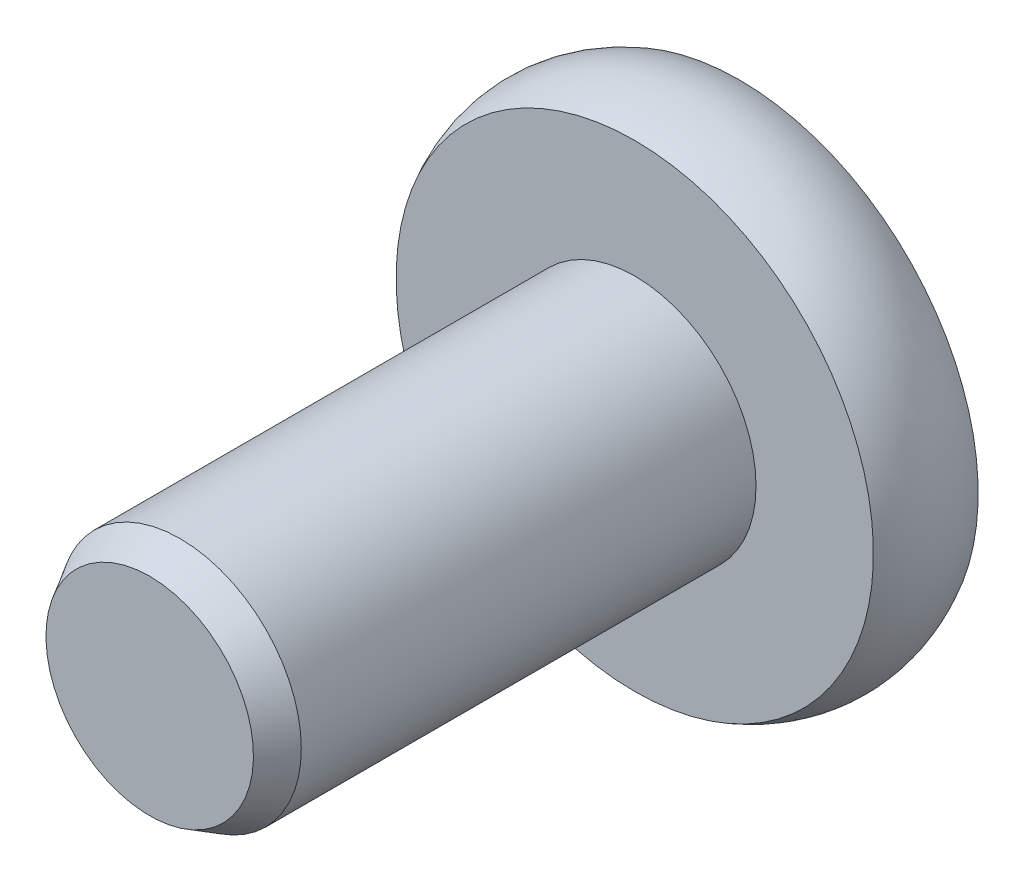
ISO-10303-21;
HEADER;
FILE_DESCRIPTION(('STEP AP214'),'2;1');
FILE_NAME('part.step','',(''),(''),'','','');
FILE_SCHEMA(('AUTOMOTIVE_DESIGN { 1 0 10303 214 1 1 1 1 }'));
ENDSEC;
DATA;
#1=APPLICATION_CONTEXT('core data for automotive mechanical design processes');
#2=APPLICATION_PROTOCOL_DEFINITION('international standard','automotive_design',2000,#1);
#3=PRODUCT_CONTEXT('',#1,'mechanical');
#4=PRODUCT('Part','Part','',(#3));
#5=PRODUCT_RELATED_PRODUCT_CATEGORY('part','',(#4));
#6=PRODUCT_DEFINITION_FORMATION('','',#4);
#7=PRODUCT_DEFINITION_CONTEXT('part definition',#1,'design');
#8=PRODUCT_DEFINITION('design','',#6,#7);
#9=PRODUCT_DEFINITION_SHAPE('','',#8);
#10=(LENGTH_UNIT() NAMED_UNIT(*) SI_UNIT(.MILLI.,.METRE.));
#11=(NAMED_UNIT(*) PLANE_ANGLE_UNIT() SI_UNIT($,.RADIAN.));
#12=(NAMED_UNIT(*) SI_UNIT($,.STERADIAN.) SOLID_ANGLE_UNIT());
#13=UNCERTAINTY_MEASURE_WITH_UNIT(LENGTH_MEASURE(1.E-05),#10,'distance_accuracy_value','');
#14=(GEOMETRIC_REPRESENTATION_CONTEXT(3) GLOBAL_UNCERTAINTY_ASSIGNED_CONTEXT((#13)) GLOBAL_UNIT_ASSIGNED_CONTEXT((#10,
#11,#12)) REPRESENTATION_CONTEXT('',''));
#15=CARTESIAN_POINT('',(0.,0.,0.));
#16=DIRECTION('',(0.,0.,1.));
#17=DIRECTION('',(1.,0.,0.));
#18=AXIS2_PLACEMENT_3D('',#15,#16,#17);
#19=CARTESIAN_POINT('',(0.,0.,-3.8608));
#20=DIRECTION('',(0.,0.,1.));
#21=DIRECTION('',(0.,-1.,0.));
#22=AXIS2_PLACEMENT_3D('',#19,#20,#21);
#23=PLANE('',#22);
#24=CARTESIAN_POINT('',(0.,0.,-3.8608));
#25=DIRECTION('',(0.,0.,1.));
#26=DIRECTION('',(0.,-1.,0.));
#27=AXIS2_PLACEMENT_3D('',#24,#25,#26);
#28=CIRCLE('',#27,3.1242);
#29=CARTESIAN_POINT('',(0.,-3.1242,-3.8608));
#30=VERTEX_POINT('',#29);
#31=EDGE_CURVE('E104',#30,#30,#28,.T.);
#32=ORIENTED_EDGE('',*,*,#31,.F.);
#33=EDGE_LOOP('',(#32));
#34=FACE_BOUND('',#33,.T.);
#35=ADVANCED_FACE('F84',(#34),#23,.F.);
#36=CARTESIAN_POINT('',(0.,1.5875,3.8608));
#37=DIRECTION('',(0.,0.,-1.));
#38=DIRECTION('',(0.,1.,0.));
#39=AXIS2_PLACEMENT_3D('',#36,#37,#38);
#40=PLANE('',#39);
#41=CARTESIAN_POINT('',(0.,0.,3.8608));
#42=DIRECTION('',(0.,0.,-1.));
#43=DIRECTION('',(0.,1.,0.));
#44=AXIS2_PLACEMENT_3D('',#41,#42,#43);
#45=CIRCLE('',#44,1.35836411191536);
#46=CARTESIAN_POINT('',(0.,1.35836411191536,3.8608));
#47=VERTEX_POINT('',#46);
#48=EDGE_CURVE('E91',#47,#47,#45,.F.);
#49=ORIENTED_EDGE('',*,*,#48,.T.);
#50=EDGE_LOOP('',(#49));
#51=FACE_BOUND('',#50,.T.);
#52=ADVANCED_FACE('F111',(#51),#40,.F.);
#53=CARTESIAN_POINT('',(0.,0.,3.8608));
#54=DIRECTION('',(0.,0.,1.));
#55=DIRECTION('',(0.,-1.,0.));
#56=AXIS2_PLACEMENT_3D('',#53,#54,#55);
#57=CYLINDRICAL_SURFACE('',#56,1.5875);
#58=CARTESIAN_POINT('',(0.,0.,3.46392499999999));
#59=DIRECTION('',(0.,0.,-1.));
#60=DIRECTION('',(0.,1.,0.));
#61=AXIS2_PLACEMENT_3D('',#58,#59,#60);
#62=CIRCLE('',#61,1.5875);
#63=CARTESIAN_POINT('',(0.,1.5875,3.46392499999999));
#64=VERTEX_POINT('',#63);
#65=EDGE_CURVE('E11',#64,#64,#62,.T.);
#66=ORIENTED_EDGE('',*,*,#65,.T.);
#67=EDGE_LOOP('',(#66));
#68=FACE_BOUND('',#67,.T.);
#69=CARTESIAN_POINT('',(0.,0.,-2.4892));
#70=DIRECTION('',(0.,0.,1.));
#71=DIRECTION('',(0.,-1.,0.));
#72=AXIS2_PLACEMENT_3D('',#69,#70,#71);
#73=CIRCLE('',#72,1.5875);
#74=CARTESIAN_POINT('',(0.,-1.5875,-2.4892));
#75=VERTEX_POINT('',#74);
#76=EDGE_CURVE('E95',#75,#75,#73,.T.);
#77=ORIENTED_EDGE('',*,*,#76,.T.);
#78=EDGE_LOOP('',(#77));
#79=FACE_BOUND('',#78,.T.);
#80=ADVANCED_FACE('F115',(#68,#79),#57,.T.);
#81=CARTESIAN_POINT('',(0.,1.5875,-2.4892));
#82=DIRECTION('',(0.,0.,-1.));
#83=DIRECTION('',(0.,1.,0.));
#84=AXIS2_PLACEMENT_3D('',#81,#82,#83);
#85=PLANE('',#84);
#86=ORIENTED_EDGE('',*,*,#76,.F.);
#87=EDGE_LOOP('',(#86));
#88=FACE_BOUND('',#87,.T.);
#89=CARTESIAN_POINT('',(0.,0.,-2.4892));
#90=DIRECTION('',(0.,0.,1.));
#91=DIRECTION('',(0.,-1.,0.));
#92=AXIS2_PLACEMENT_3D('',#89,#90,#91);
#93=CIRCLE('',#92,3.1242);
#94=CARTESIAN_POINT('',(0.,-3.1242,-2.4892));
#95=VERTEX_POINT('',#94);
#96=EDGE_CURVE('E99',#95,#95,#93,.T.);
#97=ORIENTED_EDGE('',*,*,#96,.T.);
#98=EDGE_LOOP('',(#97));
#99=FACE_BOUND('',#98,.T.);
#100=ADVANCED_FACE('F120',(#88,#99),#85,.F.);
#101=CARTESIAN_POINT('',(0.,0.,-3.175));
#102=DIRECTION('',(0.,0.,1.));
#103=DIRECTION('',(0.,-1.,0.));
#104=AXIS2_PLACEMENT_3D('',#101,#102,#103);
#105=TOROIDAL_SURFACE('',#104,1.89048571428572,1.41151428571428);
#106=ORIENTED_EDGE('',*,*,#96,.F.);
#107=EDGE_LOOP('',(#106));
#108=FACE_BOUND('',#107,.T.);
#109=ORIENTED_EDGE('',*,*,#31,.T.);
#110=EDGE_LOOP('',(#109));
#111=FACE_BOUND('',#110,.T.);
#112=ADVANCED_FACE('F108',(#108,#111),#105,.T.);
#113=CARTESIAN_POINT('',(0.,0.,3.8608));
#114=DIRECTION('',(0.,0.,-1.));
#115=DIRECTION('',(0.,1.,0.));
#116=AXIS2_PLACEMENT_3D('',#113,#114,#115);
#117=CONICAL_SURFACE('',#116,1.35836411191536,0.523598775598296);
#118=ORIENTED_EDGE('',*,*,#65,.F.);
#119=EDGE_LOOP('',(#118));
#120=FACE_BOUND('',#119,.T.);
#121=ORIENTED_EDGE('',*,*,#48,.F.);
#122=EDGE_LOOP('',(#121));
#123=FACE_BOUND('',#122,.T.);
#124=ADVANCED_FACE('F86',(#120,#123),#117,.T.);
#125=CLOSED_SHELL('',(#35,#52,#80,#100,#112,#124));
#126=MANIFOLD_SOLID_BREP('B2',#125);
#127=ADVANCED_BREP_SHAPE_REPRESENTATION('',(#18,#126),#14);
#128=SHAPE_DEFINITION_REPRESENTATION(#9,#127);
ENDSEC;
END-ISO-10303-21;
